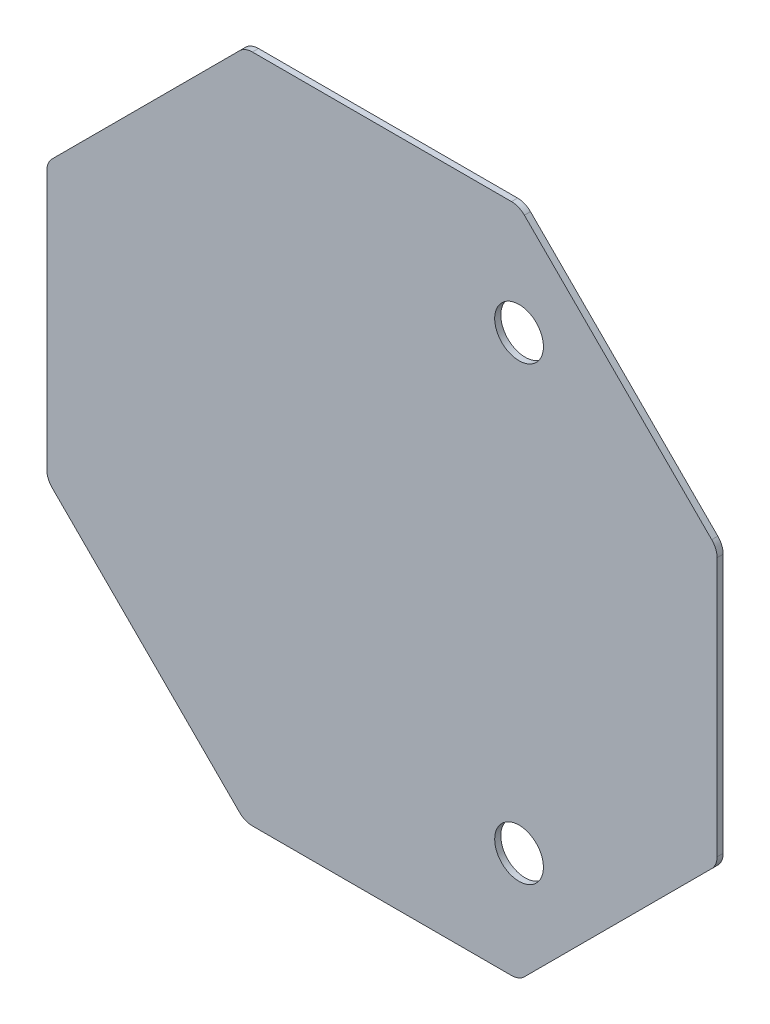
ISO-10303-21;
HEADER;
FILE_DESCRIPTION(('STEP AP214'),'2;1');
FILE_NAME('part.step','',(''),(''),'','','');
FILE_SCHEMA(('AUTOMOTIVE_DESIGN { 1 0 10303 214 1 1 1 1 }'));
ENDSEC;
DATA;
#1=APPLICATION_CONTEXT('core data for automotive mechanical design processes');
#2=APPLICATION_PROTOCOL_DEFINITION('international standard','automotive_design',2000,#1);
#3=PRODUCT_CONTEXT('',#1,'mechanical');
#4=PRODUCT('Part','Part','',(#3));
#5=PRODUCT_RELATED_PRODUCT_CATEGORY('part','',(#4));
#6=PRODUCT_DEFINITION_FORMATION('','',#4);
#7=PRODUCT_DEFINITION_CONTEXT('part definition',#1,'design');
#8=PRODUCT_DEFINITION('design','',#6,#7);
#9=PRODUCT_DEFINITION_SHAPE('','',#8);
#10=(LENGTH_UNIT() NAMED_UNIT(*) SI_UNIT(.MILLI.,.METRE.));
#11=(NAMED_UNIT(*) PLANE_ANGLE_UNIT() SI_UNIT($,.RADIAN.));
#12=(NAMED_UNIT(*) SI_UNIT($,.STERADIAN.) SOLID_ANGLE_UNIT());
#13=UNCERTAINTY_MEASURE_WITH_UNIT(LENGTH_MEASURE(1.E-05),#10,'distance_accuracy_value','');
#14=(GEOMETRIC_REPRESENTATION_CONTEXT(3) GLOBAL_UNCERTAINTY_ASSIGNED_CONTEXT((#13)) GLOBAL_UNIT_ASSIGNED_CONTEXT((#10,
#11,#12)) REPRESENTATION_CONTEXT('',''));
#15=CARTESIAN_POINT('',(0.,0.,0.));
#16=DIRECTION('',(0.,0.,1.));
#17=DIRECTION('',(1.,0.,0.));
#18=AXIS2_PLACEMENT_3D('',#15,#16,#17);
#19=CARTESIAN_POINT('',(-52.,21.2573593128807,1.));
#20=DIRECTION('',(0.,0.,1.));
#21=DIRECTION('',(1.,0.,0.));
#22=AXIS2_PLACEMENT_3D('',#19,#20,#21);
#23=PLANE('',#22);
#24=CARTESIAN_POINT('',(22.5,37.,1.));
#25=DIRECTION('',(0.,0.,1.));
#26=DIRECTION('',(1.,0.,0.));
#27=AXIS2_PLACEMENT_3D('',#24,#25,#26);
#28=CIRCLE('',#27,4.);
#29=CARTESIAN_POINT('',(26.5,37.,1.));
#30=VERTEX_POINT('',#29);
#31=EDGE_CURVE('E181',#30,#30,#28,.T.);
#32=ORIENTED_EDGE('',*,*,#31,.F.);
#33=EDGE_LOOP('',(#32));
#34=FACE_BOUND('',#33,.T.);
#35=CARTESIAN_POINT('',(-52.,21.2573593128807,1.));
#36=DIRECTION('',(0.,0.,1.));
#37=DIRECTION('',(1.,0.,0.));
#38=AXIS2_PLACEMENT_3D('',#35,#36,#37);
#39=CIRCLE('',#38,3.);
#40=CARTESIAN_POINT('',(-54.1213203435596,23.3786796564404,1.));
#41=VERTEX_POINT('',#40);
#42=CARTESIAN_POINT('',(-55.,21.2573593128807,1.));
#43=VERTEX_POINT('',#42);
#44=EDGE_CURVE('E208',#41,#43,#39,.T.);
#45=ORIENTED_EDGE('',*,*,#44,.T.);
#46=DIRECTION('',(0.,-1.,0.));
#47=VECTOR('',#46,1.);
#48=CARTESIAN_POINT('',(-55.,-21.2573593128807,1.));
#49=LINE('',#48,#47);
#50=CARTESIAN_POINT('',(-55.,-21.2573593128807,1.));
#51=VERTEX_POINT('',#50);
#52=EDGE_CURVE('E116',#43,#51,#49,.T.);
#53=ORIENTED_EDGE('',*,*,#52,.T.);
#54=CARTESIAN_POINT('',(-52.,-21.2573593128807,1.));
#55=DIRECTION('',(0.,0.,1.));
#56=DIRECTION('',(1.,0.,0.));
#57=AXIS2_PLACEMENT_3D('',#54,#55,#56);
#58=CIRCLE('',#57,3.);
#59=CARTESIAN_POINT('',(-54.1213203435596,-23.3786796564404,1.));
#60=VERTEX_POINT('',#59);
#61=EDGE_CURVE('E247',#51,#60,#58,.T.);
#62=ORIENTED_EDGE('',*,*,#61,.T.);
#63=DIRECTION('',(0.707106781186548,-0.707106781186547,0.));
#64=VECTOR('',#63,1.);
#65=CARTESIAN_POINT('',(-54.1213203435596,-23.3786796564404,1.));
#66=LINE('',#65,#64);
#67=CARTESIAN_POINT('',(-23.3786796564404,-54.1213203435596,1.));
#68=VERTEX_POINT('',#67);
#69=EDGE_CURVE('E266',#60,#68,#66,.T.);
#70=ORIENTED_EDGE('',*,*,#69,.T.);
#71=CARTESIAN_POINT('',(-21.2573593128807,-52.,1.));
#72=DIRECTION('',(0.,0.,1.));
#73=DIRECTION('',(1.,0.,0.));
#74=AXIS2_PLACEMENT_3D('',#71,#72,#73);
#75=CIRCLE('',#74,3.);
#76=CARTESIAN_POINT('',(-21.2573593128807,-55.,1.));
#77=VERTEX_POINT('',#76);
#78=EDGE_CURVE('E263',#68,#77,#75,.T.);
#79=ORIENTED_EDGE('',*,*,#78,.T.);
#80=DIRECTION('',(1.,0.,0.));
#81=VECTOR('',#80,1.);
#82=CARTESIAN_POINT('',(-21.2573593128807,-55.,1.));
#83=LINE('',#82,#81);
#84=CARTESIAN_POINT('',(21.2573593128807,-55.,1.));
#85=VERTEX_POINT('',#84);
#86=EDGE_CURVE('E265',#77,#85,#83,.T.);
#87=ORIENTED_EDGE('',*,*,#86,.T.);
#88=CARTESIAN_POINT('',(21.2573593128807,-52.,1.));
#89=DIRECTION('',(0.,0.,1.));
#90=DIRECTION('',(1.,0.,0.));
#91=AXIS2_PLACEMENT_3D('',#88,#89,#90);
#92=CIRCLE('',#91,3.);
#93=CARTESIAN_POINT('',(23.3786796564404,-54.1213203435596,1.));
#94=VERTEX_POINT('',#93);
#95=EDGE_CURVE('E268',#85,#94,#92,.T.);
#96=ORIENTED_EDGE('',*,*,#95,.T.);
#97=DIRECTION('',(0.707106781186547,0.707106781186548,0.));
#98=VECTOR('',#97,1.);
#99=CARTESIAN_POINT('',(23.3786796564404,-54.1213203435596,1.));
#100=LINE('',#99,#98);
#101=CARTESIAN_POINT('',(54.1213203435596,-23.3786796564404,1.));
#102=VERTEX_POINT('',#101);
#103=EDGE_CURVE('E274',#94,#102,#100,.T.);
#104=ORIENTED_EDGE('',*,*,#103,.T.);
#105=CARTESIAN_POINT('',(52.,-21.2573593128807,1.));
#106=DIRECTION('',(0.,0.,1.));
#107=DIRECTION('',(1.,0.,0.));
#108=AXIS2_PLACEMENT_3D('',#105,#106,#107);
#109=CIRCLE('',#108,3.);
#110=CARTESIAN_POINT('',(55.,-21.2573593128807,1.));
#111=VERTEX_POINT('',#110);
#112=EDGE_CURVE('E276',#102,#111,#109,.T.);
#113=ORIENTED_EDGE('',*,*,#112,.T.);
#114=DIRECTION('',(0.,1.,0.));
#115=VECTOR('',#114,1.);
#116=CARTESIAN_POINT('',(55.,-21.2573593128807,1.));
#117=LINE('',#116,#115);
#118=CARTESIAN_POINT('',(55.,21.2573593128807,1.));
#119=VERTEX_POINT('',#118);
#120=EDGE_CURVE('E278',#111,#119,#117,.T.);
#121=ORIENTED_EDGE('',*,*,#120,.T.);
#122=CARTESIAN_POINT('',(52.,21.2573593128807,1.));
#123=DIRECTION('',(0.,0.,1.));
#124=DIRECTION('',(1.,0.,0.));
#125=AXIS2_PLACEMENT_3D('',#122,#123,#124);
#126=CIRCLE('',#125,3.);
#127=CARTESIAN_POINT('',(54.1213203435596,23.3786796564404,1.));
#128=VERTEX_POINT('',#127);
#129=EDGE_CURVE('E280',#119,#128,#126,.T.);
#130=ORIENTED_EDGE('',*,*,#129,.T.);
#131=DIRECTION('',(-0.707106781186547,0.707106781186548,0.));
#132=VECTOR('',#131,1.);
#133=CARTESIAN_POINT('',(23.3786796564404,54.1213203435596,1.));
#134=LINE('',#133,#132);
#135=CARTESIAN_POINT('',(23.3786796564404,54.1213203435596,1.));
#136=VERTEX_POINT('',#135);
#137=EDGE_CURVE('E282',#128,#136,#134,.T.);
#138=ORIENTED_EDGE('',*,*,#137,.T.);
#139=CARTESIAN_POINT('',(21.2573593128807,52.,1.));
#140=DIRECTION('',(0.,0.,1.));
#141=DIRECTION('',(1.,0.,0.));
#142=AXIS2_PLACEMENT_3D('',#139,#140,#141);
#143=CIRCLE('',#142,3.);
#144=CARTESIAN_POINT('',(21.2573593128807,55.,1.));
#145=VERTEX_POINT('',#144);
#146=EDGE_CURVE('E159',#136,#145,#143,.T.);
#147=ORIENTED_EDGE('',*,*,#146,.T.);
#148=DIRECTION('',(-1.,0.,0.));
#149=VECTOR('',#148,1.);
#150=CARTESIAN_POINT('',(-21.2573593128807,55.,1.));
#151=LINE('',#150,#149);
#152=CARTESIAN_POINT('',(-21.2573593128807,55.,1.));
#153=VERTEX_POINT('',#152);
#154=EDGE_CURVE('E153',#145,#153,#151,.T.);
#155=ORIENTED_EDGE('',*,*,#154,.T.);
#156=CARTESIAN_POINT('',(-21.2573593128807,52.,1.));
#157=DIRECTION('',(0.,0.,1.));
#158=DIRECTION('',(-1.,0.,0.));
#159=AXIS2_PLACEMENT_3D('',#156,#157,#158);
#160=CIRCLE('',#159,3.);
#161=CARTESIAN_POINT('',(-23.3786796564404,54.1213203435596,1.));
#162=VERTEX_POINT('',#161);
#163=EDGE_CURVE('E157',#153,#162,#160,.T.);
#164=ORIENTED_EDGE('',*,*,#163,.T.);
#165=DIRECTION('',(-0.707106781186548,-0.707106781186547,0.));
#166=VECTOR('',#165,1.);
#167=CARTESIAN_POINT('',(-23.3786796564404,54.1213203435596,1.));
#168=LINE('',#167,#166);
#169=EDGE_CURVE('E49',#162,#41,#168,.T.);
#170=ORIENTED_EDGE('',*,*,#169,.T.);
#171=EDGE_LOOP('',(#45,#53,#62,#70,#79,#87,#96,#104,#113,#121,#130,#138,#147,#155,#164,#170));
#172=FACE_BOUND('',#171,.T.);
#173=CARTESIAN_POINT('',(22.5,-37.,1.));
#174=DIRECTION('',(0.,0.,1.));
#175=DIRECTION('',(-1.,0.,0.));
#176=AXIS2_PLACEMENT_3D('',#173,#174,#175);
#177=CIRCLE('',#176,4.);
#178=CARTESIAN_POINT('',(18.5,-37.,1.));
#179=VERTEX_POINT('',#178);
#180=EDGE_CURVE('E324',#179,#179,#177,.T.);
#181=ORIENTED_EDGE('',*,*,#180,.F.);
#182=EDGE_LOOP('',(#181));
#183=FACE_BOUND('',#182,.T.);
#184=ADVANCED_FACE('F32',(#34,#172,#183),#23,.T.);
#185=CARTESIAN_POINT('',(-52.,21.2573593128807,0.));
#186=DIRECTION('',(0.,0.,1.));
#187=DIRECTION('',(1.,0.,0.));
#188=AXIS2_PLACEMENT_3D('',#185,#186,#187);
#189=PLANE('',#188);
#190=CARTESIAN_POINT('',(-52.,21.2573593128807,0.));
#191=DIRECTION('',(0.,0.,1.));
#192=DIRECTION('',(1.,0.,0.));
#193=AXIS2_PLACEMENT_3D('',#190,#191,#192);
#194=CIRCLE('',#193,3.);
#195=CARTESIAN_POINT('',(-54.1213203435596,23.3786796564404,0.));
#196=VERTEX_POINT('',#195);
#197=CARTESIAN_POINT('',(-55.,21.2573593128807,0.));
#198=VERTEX_POINT('',#197);
#199=EDGE_CURVE('E177',#196,#198,#194,.T.);
#200=ORIENTED_EDGE('',*,*,#199,.F.);
#201=DIRECTION('',(-0.707106781186548,-0.707106781186547,0.));
#202=VECTOR('',#201,1.);
#203=CARTESIAN_POINT('',(-23.3786796564404,54.1213203435596,0.));
#204=LINE('',#203,#202);
#205=CARTESIAN_POINT('',(-23.3786796564404,54.1213203435596,0.));
#206=VERTEX_POINT('',#205);
#207=EDGE_CURVE('E108',#206,#196,#204,.T.);
#208=ORIENTED_EDGE('',*,*,#207,.F.);
#209=CARTESIAN_POINT('',(-21.2573593128807,52.,0.));
#210=DIRECTION('',(0.,0.,1.));
#211=DIRECTION('',(-1.,0.,0.));
#212=AXIS2_PLACEMENT_3D('',#209,#210,#211);
#213=CIRCLE('',#212,3.);
#214=CARTESIAN_POINT('',(-21.2573593128807,55.,0.));
#215=VERTEX_POINT('',#214);
#216=EDGE_CURVE('E102',#215,#206,#213,.T.);
#217=ORIENTED_EDGE('',*,*,#216,.F.);
#218=DIRECTION('',(-1.,0.,0.));
#219=VECTOR('',#218,1.);
#220=CARTESIAN_POINT('',(-21.2573593128807,55.,0.));
#221=LINE('',#220,#219);
#222=CARTESIAN_POINT('',(21.2573593128807,55.,0.));
#223=VERTEX_POINT('',#222);
#224=EDGE_CURVE('E167',#223,#215,#221,.T.);
#225=ORIENTED_EDGE('',*,*,#224,.F.);
#226=CARTESIAN_POINT('',(21.2573593128807,52.,0.));
#227=DIRECTION('',(0.,0.,1.));
#228=DIRECTION('',(1.,0.,0.));
#229=AXIS2_PLACEMENT_3D('',#226,#227,#228);
#230=CIRCLE('',#229,3.);
#231=CARTESIAN_POINT('',(23.3786796564404,54.1213203435596,0.));
#232=VERTEX_POINT('',#231);
#233=EDGE_CURVE('E203',#232,#223,#230,.T.);
#234=ORIENTED_EDGE('',*,*,#233,.F.);
#235=DIRECTION('',(-0.707106781186547,0.707106781186548,0.));
#236=VECTOR('',#235,1.);
#237=CARTESIAN_POINT('',(23.3786796564404,54.1213203435596,0.));
#238=LINE('',#237,#236);
#239=CARTESIAN_POINT('',(54.1213203435596,23.3786796564404,0.));
#240=VERTEX_POINT('',#239);
#241=EDGE_CURVE('E201',#240,#232,#238,.T.);
#242=ORIENTED_EDGE('',*,*,#241,.F.);
#243=CARTESIAN_POINT('',(52.,21.2573593128807,0.));
#244=DIRECTION('',(0.,0.,1.));
#245=DIRECTION('',(1.,0.,0.));
#246=AXIS2_PLACEMENT_3D('',#243,#244,#245);
#247=CIRCLE('',#246,3.);
#248=CARTESIAN_POINT('',(55.,21.2573593128807,0.));
#249=VERTEX_POINT('',#248);
#250=EDGE_CURVE('E199',#249,#240,#247,.T.);
#251=ORIENTED_EDGE('',*,*,#250,.F.);
#252=DIRECTION('',(0.,1.,0.));
#253=VECTOR('',#252,1.);
#254=CARTESIAN_POINT('',(55.,-21.2573593128807,0.));
#255=LINE('',#254,#253);
#256=CARTESIAN_POINT('',(55.,-21.2573593128807,0.));
#257=VERTEX_POINT('',#256);
#258=EDGE_CURVE('E197',#257,#249,#255,.T.);
#259=ORIENTED_EDGE('',*,*,#258,.F.);
#260=CARTESIAN_POINT('',(52.,-21.2573593128807,0.));
#261=DIRECTION('',(0.,0.,1.));
#262=DIRECTION('',(1.,0.,0.));
#263=AXIS2_PLACEMENT_3D('',#260,#261,#262);
#264=CIRCLE('',#263,3.);
#265=CARTESIAN_POINT('',(54.1213203435596,-23.3786796564404,0.));
#266=VERTEX_POINT('',#265);
#267=EDGE_CURVE('E195',#266,#257,#264,.T.);
#268=ORIENTED_EDGE('',*,*,#267,.F.);
#269=DIRECTION('',(0.707106781186547,0.707106781186548,0.));
#270=VECTOR('',#269,1.);
#271=CARTESIAN_POINT('',(23.3786796564404,-54.1213203435596,0.));
#272=LINE('',#271,#270);
#273=CARTESIAN_POINT('',(23.3786796564404,-54.1213203435596,0.));
#274=VERTEX_POINT('',#273);
#275=EDGE_CURVE('E193',#274,#266,#272,.T.);
#276=ORIENTED_EDGE('',*,*,#275,.F.);
#277=CARTESIAN_POINT('',(21.2573593128807,-52.,0.));
#278=DIRECTION('',(0.,0.,1.));
#279=DIRECTION('',(1.,0.,0.));
#280=AXIS2_PLACEMENT_3D('',#277,#278,#279);
#281=CIRCLE('',#280,3.);
#282=CARTESIAN_POINT('',(21.2573593128807,-55.,0.));
#283=VERTEX_POINT('',#282);
#284=EDGE_CURVE('E191',#283,#274,#281,.T.);
#285=ORIENTED_EDGE('',*,*,#284,.F.);
#286=DIRECTION('',(1.,0.,0.));
#287=VECTOR('',#286,1.);
#288=CARTESIAN_POINT('',(-21.2573593128807,-55.,0.));
#289=LINE('',#288,#287);
#290=CARTESIAN_POINT('',(-21.2573593128807,-55.,0.));
#291=VERTEX_POINT('',#290);
#292=EDGE_CURVE('E189',#291,#283,#289,.T.);
#293=ORIENTED_EDGE('',*,*,#292,.F.);
#294=CARTESIAN_POINT('',(-21.2573593128807,-52.,0.));
#295=DIRECTION('',(0.,0.,1.));
#296=DIRECTION('',(1.,0.,0.));
#297=AXIS2_PLACEMENT_3D('',#294,#295,#296);
#298=CIRCLE('',#297,3.);
#299=CARTESIAN_POINT('',(-23.3786796564404,-54.1213203435596,0.));
#300=VERTEX_POINT('',#299);
#301=EDGE_CURVE('E187',#300,#291,#298,.T.);
#302=ORIENTED_EDGE('',*,*,#301,.F.);
#303=DIRECTION('',(0.707106781186548,-0.707106781186547,0.));
#304=VECTOR('',#303,1.);
#305=CARTESIAN_POINT('',(-54.1213203435596,-23.3786796564404,0.));
#306=LINE('',#305,#304);
#307=CARTESIAN_POINT('',(-54.1213203435596,-23.3786796564404,0.));
#308=VERTEX_POINT('',#307);
#309=EDGE_CURVE('E185',#308,#300,#306,.T.);
#310=ORIENTED_EDGE('',*,*,#309,.F.);
#311=CARTESIAN_POINT('',(-52.,-21.2573593128807,0.));
#312=DIRECTION('',(0.,0.,1.));
#313=DIRECTION('',(1.,0.,0.));
#314=AXIS2_PLACEMENT_3D('',#311,#312,#313);
#315=CIRCLE('',#314,3.);
#316=CARTESIAN_POINT('',(-55.,-21.2573593128807,0.));
#317=VERTEX_POINT('',#316);
#318=EDGE_CURVE('E183',#317,#308,#315,.T.);
#319=ORIENTED_EDGE('',*,*,#318,.F.);
#320=DIRECTION('',(0.,-1.,0.));
#321=VECTOR('',#320,1.);
#322=CARTESIAN_POINT('',(-55.,-21.2573593128807,0.));
#323=LINE('',#322,#321);
#324=EDGE_CURVE('E180',#198,#317,#323,.T.);
#325=ORIENTED_EDGE('',*,*,#324,.F.);
#326=EDGE_LOOP('',(#200,#208,#217,#225,#234,#242,#251,#259,#268,#276,#285,#293,#302,#310,#319,#325));
#327=FACE_BOUND('',#326,.T.);
#328=CARTESIAN_POINT('',(22.5,37.,0.));
#329=DIRECTION('',(0.,0.,1.));
#330=DIRECTION('',(1.,0.,0.));
#331=AXIS2_PLACEMENT_3D('',#328,#329,#330);
#332=CIRCLE('',#331,4.);
#333=CARTESIAN_POINT('',(26.5,37.,0.));
#334=VERTEX_POINT('',#333);
#335=EDGE_CURVE('E330',#334,#334,#332,.T.);
#336=ORIENTED_EDGE('',*,*,#335,.T.);
#337=EDGE_LOOP('',(#336));
#338=FACE_BOUND('',#337,.T.);
#339=CARTESIAN_POINT('',(22.5,-37.,0.));
#340=DIRECTION('',(0.,0.,1.));
#341=DIRECTION('',(-1.,0.,0.));
#342=AXIS2_PLACEMENT_3D('',#339,#340,#341);
#343=CIRCLE('',#342,4.);
#344=CARTESIAN_POINT('',(18.5,-37.,0.));
#345=VERTEX_POINT('',#344);
#346=EDGE_CURVE('E327',#345,#345,#343,.T.);
#347=ORIENTED_EDGE('',*,*,#346,.T.);
#348=EDGE_LOOP('',(#347));
#349=FACE_BOUND('',#348,.T.);
#350=ADVANCED_FACE('F251',(#327,#338,#349),#189,.F.);
#351=CARTESIAN_POINT('',(-52.,21.2573593128807,1.));
#352=DIRECTION('',(0.,0.,-1.));
#353=DIRECTION('',(-1.,0.,0.));
#354=AXIS2_PLACEMENT_3D('',#351,#352,#353);
#355=CYLINDRICAL_SURFACE('',#354,3.);
#356=ORIENTED_EDGE('',*,*,#199,.T.);
#357=DIRECTION('',(0.,0.,-1.));
#358=VECTOR('',#357,1.);
#359=CARTESIAN_POINT('',(-55.,21.2573593128807,1.));
#360=LINE('',#359,#358);
#361=EDGE_CURVE('E11',#43,#198,#360,.T.);
#362=ORIENTED_EDGE('',*,*,#361,.F.);
#363=ORIENTED_EDGE('',*,*,#44,.F.);
#364=DIRECTION('',(0.,0.,-1.));
#365=VECTOR('',#364,1.);
#366=CARTESIAN_POINT('',(-54.1213203435596,23.3786796564404,1.));
#367=LINE('',#366,#365);
#368=EDGE_CURVE('E173',#41,#196,#367,.T.);
#369=ORIENTED_EDGE('',*,*,#368,.T.);
#370=EDGE_LOOP('',(#356,#362,#363,#369));
#371=FACE_BOUND('',#370,.T.);
#372=ADVANCED_FACE('F34',(#371),#355,.T.);
#373=CARTESIAN_POINT('',(-55.,-21.2573593128807,1.));
#374=DIRECTION('',(1.,0.,0.));
#375=DIRECTION('',(0.,0.,-1.));
#376=AXIS2_PLACEMENT_3D('',#373,#374,#375);
#377=PLANE('',#376);
#378=ORIENTED_EDGE('',*,*,#324,.T.);
#379=DIRECTION('',(0.,0.,-1.));
#380=VECTOR('',#379,1.);
#381=CARTESIAN_POINT('',(-55.,-21.2573593128807,1.));
#382=LINE('',#381,#380);
#383=EDGE_CURVE('E41',#51,#317,#382,.T.);
#384=ORIENTED_EDGE('',*,*,#383,.F.);
#385=ORIENTED_EDGE('',*,*,#52,.F.);
#386=ORIENTED_EDGE('',*,*,#361,.T.);
#387=EDGE_LOOP('',(#378,#384,#385,#386));
#388=FACE_BOUND('',#387,.T.);
#389=ADVANCED_FACE('F463',(#388),#377,.F.);
#390=CARTESIAN_POINT('',(-52.,-21.2573593128807,1.));
#391=DIRECTION('',(0.,0.,-1.));
#392=DIRECTION('',(-1.,0.,0.));
#393=AXIS2_PLACEMENT_3D('',#390,#391,#392);
#394=CYLINDRICAL_SURFACE('',#393,3.);
#395=ORIENTED_EDGE('',*,*,#318,.T.);
#396=DIRECTION('',(0.,0.,-1.));
#397=VECTOR('',#396,1.);
#398=CARTESIAN_POINT('',(-54.1213203435596,-23.3786796564404,1.));
#399=LINE('',#398,#397);
#400=EDGE_CURVE('E239',#60,#308,#399,.T.);
#401=ORIENTED_EDGE('',*,*,#400,.F.);
#402=ORIENTED_EDGE('',*,*,#61,.F.);
#403=ORIENTED_EDGE('',*,*,#383,.T.);
#404=EDGE_LOOP('',(#395,#401,#402,#403));
#405=FACE_BOUND('',#404,.T.);
#406=ADVANCED_FACE('F245',(#405),#394,.T.);
#407=CARTESIAN_POINT('',(-54.1213203435596,-23.3786796564404,1.));
#408=DIRECTION('',(0.707106781186547,0.707106781186548,0.));
#409=DIRECTION('',(-0.707106781186548,0.707106781186547,0.));
#410=AXIS2_PLACEMENT_3D('',#407,#408,#409);
#411=PLANE('',#410);
#412=ORIENTED_EDGE('',*,*,#309,.T.);
#413=DIRECTION('',(0.,0.,-1.));
#414=VECTOR('',#413,1.);
#415=CARTESIAN_POINT('',(-23.3786796564404,-54.1213203435596,1.));
#416=LINE('',#415,#414);
#417=EDGE_CURVE('E236',#68,#300,#416,.T.);
#418=ORIENTED_EDGE('',*,*,#417,.F.);
#419=ORIENTED_EDGE('',*,*,#69,.F.);
#420=ORIENTED_EDGE('',*,*,#400,.T.);
#421=EDGE_LOOP('',(#412,#418,#419,#420));
#422=FACE_BOUND('',#421,.T.);
#423=ADVANCED_FACE('F257',(#422),#411,.F.);
#424=CARTESIAN_POINT('',(-21.2573593128807,-52.,1.));
#425=DIRECTION('',(0.,0.,-1.));
#426=DIRECTION('',(-1.,0.,0.));
#427=AXIS2_PLACEMENT_3D('',#424,#425,#426);
#428=CYLINDRICAL_SURFACE('',#427,3.);
#429=ORIENTED_EDGE('',*,*,#301,.T.);
#430=DIRECTION('',(0.,0.,-1.));
#431=VECTOR('',#430,1.);
#432=CARTESIAN_POINT('',(-21.2573593128807,-55.,1.));
#433=LINE('',#432,#431);
#434=EDGE_CURVE('E233',#77,#291,#433,.T.);
#435=ORIENTED_EDGE('',*,*,#434,.F.);
#436=ORIENTED_EDGE('',*,*,#78,.F.);
#437=ORIENTED_EDGE('',*,*,#417,.T.);
#438=EDGE_LOOP('',(#429,#435,#436,#437));
#439=FACE_BOUND('',#438,.T.);
#440=ADVANCED_FACE('F261',(#439),#428,.T.);
#441=CARTESIAN_POINT('',(-21.2573593128807,-55.,1.));
#442=DIRECTION('',(0.,1.,0.));
#443=DIRECTION('',(-1.,0.,0.));
#444=AXIS2_PLACEMENT_3D('',#441,#442,#443);
#445=PLANE('',#444);
#446=ORIENTED_EDGE('',*,*,#292,.T.);
#447=DIRECTION('',(0.,0.,-1.));
#448=VECTOR('',#447,1.);
#449=CARTESIAN_POINT('',(21.2573593128807,-55.,1.));
#450=LINE('',#449,#448);
#451=EDGE_CURVE('E230',#85,#283,#450,.T.);
#452=ORIENTED_EDGE('',*,*,#451,.F.);
#453=ORIENTED_EDGE('',*,*,#86,.F.);
#454=ORIENTED_EDGE('',*,*,#434,.T.);
#455=EDGE_LOOP('',(#446,#452,#453,#454));
#456=FACE_BOUND('',#455,.T.);
#457=ADVANCED_FACE('F428',(#456),#445,.F.);
#458=CARTESIAN_POINT('',(21.2573593128807,-52.,1.));
#459=DIRECTION('',(0.,0.,-1.));
#460=DIRECTION('',(-1.,0.,0.));
#461=AXIS2_PLACEMENT_3D('',#458,#459,#460);
#462=CYLINDRICAL_SURFACE('',#461,3.);
#463=ORIENTED_EDGE('',*,*,#284,.T.);
#464=DIRECTION('',(0.,0.,-1.));
#465=VECTOR('',#464,1.);
#466=CARTESIAN_POINT('',(23.3786796564404,-54.1213203435596,1.));
#467=LINE('',#466,#465);
#468=EDGE_CURVE('E227',#94,#274,#467,.T.);
#469=ORIENTED_EDGE('',*,*,#468,.F.);
#470=ORIENTED_EDGE('',*,*,#95,.F.);
#471=ORIENTED_EDGE('',*,*,#451,.T.);
#472=EDGE_LOOP('',(#463,#469,#470,#471));
#473=FACE_BOUND('',#472,.T.);
#474=ADVANCED_FACE('F418',(#473),#462,.T.);
#475=CARTESIAN_POINT('',(23.3786796564404,-54.1213203435596,1.));
#476=DIRECTION('',(-0.707106781186548,0.707106781186547,0.));
#477=DIRECTION('',(-0.707106781186547,-0.707106781186548,0.));
#478=AXIS2_PLACEMENT_3D('',#475,#476,#477);
#479=PLANE('',#478);
#480=ORIENTED_EDGE('',*,*,#275,.T.);
#481=DIRECTION('',(0.,0.,-1.));
#482=VECTOR('',#481,1.);
#483=CARTESIAN_POINT('',(54.1213203435596,-23.3786796564404,1.));
#484=LINE('',#483,#482);
#485=EDGE_CURVE('E224',#102,#266,#484,.T.);
#486=ORIENTED_EDGE('',*,*,#485,.F.);
#487=ORIENTED_EDGE('',*,*,#103,.F.);
#488=ORIENTED_EDGE('',*,*,#468,.T.);
#489=EDGE_LOOP('',(#480,#486,#487,#488));
#490=FACE_BOUND('',#489,.T.);
#491=ADVANCED_FACE('F408',(#490),#479,.F.);
#492=CARTESIAN_POINT('',(52.,-21.2573593128807,1.));
#493=DIRECTION('',(0.,0.,-1.));
#494=DIRECTION('',(-1.,0.,0.));
#495=AXIS2_PLACEMENT_3D('',#492,#493,#494);
#496=CYLINDRICAL_SURFACE('',#495,3.);
#497=ORIENTED_EDGE('',*,*,#267,.T.);
#498=DIRECTION('',(0.,0.,-1.));
#499=VECTOR('',#498,1.);
#500=CARTESIAN_POINT('',(55.,-21.2573593128807,1.));
#501=LINE('',#500,#499);
#502=EDGE_CURVE('E221',#111,#257,#501,.T.);
#503=ORIENTED_EDGE('',*,*,#502,.F.);
#504=ORIENTED_EDGE('',*,*,#112,.F.);
#505=ORIENTED_EDGE('',*,*,#485,.T.);
#506=EDGE_LOOP('',(#497,#503,#504,#505));
#507=FACE_BOUND('',#506,.T.);
#508=ADVANCED_FACE('F398',(#507),#496,.T.);
#509=CARTESIAN_POINT('',(55.,-21.2573593128807,1.));
#510=DIRECTION('',(-1.,0.,0.));
#511=DIRECTION('',(0.,0.,1.));
#512=AXIS2_PLACEMENT_3D('',#509,#510,#511);
#513=PLANE('',#512);
#514=ORIENTED_EDGE('',*,*,#258,.T.);
#515=DIRECTION('',(0.,0.,-1.));
#516=VECTOR('',#515,1.);
#517=CARTESIAN_POINT('',(55.,21.2573593128807,1.));
#518=LINE('',#517,#516);
#519=EDGE_CURVE('E218',#119,#249,#518,.T.);
#520=ORIENTED_EDGE('',*,*,#519,.F.);
#521=ORIENTED_EDGE('',*,*,#120,.F.);
#522=ORIENTED_EDGE('',*,*,#502,.T.);
#523=EDGE_LOOP('',(#514,#520,#521,#522));
#524=FACE_BOUND('',#523,.T.);
#525=ADVANCED_FACE('F388',(#524),#513,.F.);
#526=CARTESIAN_POINT('',(52.,21.2573593128807,1.));
#527=DIRECTION('',(0.,0.,-1.));
#528=DIRECTION('',(-1.,0.,0.));
#529=AXIS2_PLACEMENT_3D('',#526,#527,#528);
#530=CYLINDRICAL_SURFACE('',#529,3.);
#531=ORIENTED_EDGE('',*,*,#250,.T.);
#532=DIRECTION('',(0.,0.,-1.));
#533=VECTOR('',#532,1.);
#534=CARTESIAN_POINT('',(54.1213203435596,23.3786796564404,1.));
#535=LINE('',#534,#533);
#536=EDGE_CURVE('E215',#128,#240,#535,.T.);
#537=ORIENTED_EDGE('',*,*,#536,.F.);
#538=ORIENTED_EDGE('',*,*,#129,.F.);
#539=ORIENTED_EDGE('',*,*,#519,.T.);
#540=EDGE_LOOP('',(#531,#537,#538,#539));
#541=FACE_BOUND('',#540,.T.);
#542=ADVANCED_FACE('F379',(#541),#530,.T.);
#543=CARTESIAN_POINT('',(23.3786796564404,54.1213203435596,1.));
#544=DIRECTION('',(-0.707106781186548,-0.707106781186547,0.));
#545=DIRECTION('',(0.707106781186547,-0.707106781186548,0.));
#546=AXIS2_PLACEMENT_3D('',#543,#544,#545);
#547=PLANE('',#546);
#548=ORIENTED_EDGE('',*,*,#241,.T.);
#549=DIRECTION('',(0.,0.,-1.));
#550=VECTOR('',#549,1.);
#551=CARTESIAN_POINT('',(23.3786796564404,54.1213203435596,1.));
#552=LINE('',#551,#550);
#553=EDGE_CURVE('E212',#136,#232,#552,.T.);
#554=ORIENTED_EDGE('',*,*,#553,.F.);
#555=ORIENTED_EDGE('',*,*,#137,.F.);
#556=ORIENTED_EDGE('',*,*,#536,.T.);
#557=EDGE_LOOP('',(#548,#554,#555,#556));
#558=FACE_BOUND('',#557,.T.);
#559=ADVANCED_FACE('F288',(#558),#547,.F.);
#560=CARTESIAN_POINT('',(21.2573593128807,52.,1.));
#561=DIRECTION('',(0.,0.,-1.));
#562=DIRECTION('',(-1.,0.,0.));
#563=AXIS2_PLACEMENT_3D('',#560,#561,#562);
#564=CYLINDRICAL_SURFACE('',#563,3.);
#565=ORIENTED_EDGE('',*,*,#233,.T.);
#566=DIRECTION('',(0.,0.,-1.));
#567=VECTOR('',#566,1.);
#568=CARTESIAN_POINT('',(21.2573593128807,55.,1.));
#569=LINE('',#568,#567);
#570=EDGE_CURVE('E168',#145,#223,#569,.T.);
#571=ORIENTED_EDGE('',*,*,#570,.F.);
#572=ORIENTED_EDGE('',*,*,#146,.F.);
#573=ORIENTED_EDGE('',*,*,#553,.T.);
#574=EDGE_LOOP('',(#565,#571,#572,#573));
#575=FACE_BOUND('',#574,.T.);
#576=ADVANCED_FACE('F292',(#575),#564,.T.);
#577=CARTESIAN_POINT('',(-21.2573593128807,55.,1.));
#578=DIRECTION('',(0.,-1.,0.));
#579=DIRECTION('',(1.,0.,0.));
#580=AXIS2_PLACEMENT_3D('',#577,#578,#579);
#581=PLANE('',#580);
#582=ORIENTED_EDGE('',*,*,#224,.T.);
#583=DIRECTION('',(0.,0.,-1.));
#584=VECTOR('',#583,1.);
#585=CARTESIAN_POINT('',(-21.2573593128807,55.,1.));
#586=LINE('',#585,#584);
#587=EDGE_CURVE('E164',#153,#215,#586,.T.);
#588=ORIENTED_EDGE('',*,*,#587,.F.);
#589=ORIENTED_EDGE('',*,*,#154,.F.);
#590=ORIENTED_EDGE('',*,*,#570,.T.);
#591=EDGE_LOOP('',(#582,#588,#589,#590));
#592=FACE_BOUND('',#591,.T.);
#593=ADVANCED_FACE('F165',(#592),#581,.F.);
#594=CARTESIAN_POINT('',(-21.2573593128807,52.,1.));
#595=DIRECTION('',(0.,0.,-1.));
#596=DIRECTION('',(-1.,0.,0.));
#597=AXIS2_PLACEMENT_3D('',#594,#595,#596);
#598=CYLINDRICAL_SURFACE('',#597,3.);
#599=ORIENTED_EDGE('',*,*,#216,.T.);
#600=DIRECTION('',(0.,0.,-1.));
#601=VECTOR('',#600,1.);
#602=CARTESIAN_POINT('',(-23.3786796564404,54.1213203435596,1.));
#603=LINE('',#602,#601);
#604=EDGE_CURVE('E169',#162,#206,#603,.T.);
#605=ORIENTED_EDGE('',*,*,#604,.F.);
#606=ORIENTED_EDGE('',*,*,#163,.F.);
#607=ORIENTED_EDGE('',*,*,#587,.T.);
#608=EDGE_LOOP('',(#599,#605,#606,#607));
#609=FACE_BOUND('',#608,.T.);
#610=ADVANCED_FACE('F171',(#609),#598,.T.);
#611=CARTESIAN_POINT('',(-23.3786796564404,54.1213203435596,1.));
#612=DIRECTION('',(0.707106781186547,-0.707106781186548,0.));
#613=DIRECTION('',(0.707106781186548,0.707106781186547,0.));
#614=AXIS2_PLACEMENT_3D('',#611,#612,#613);
#615=PLANE('',#614);
#616=ORIENTED_EDGE('',*,*,#207,.T.);
#617=ORIENTED_EDGE('',*,*,#368,.F.);
#618=ORIENTED_EDGE('',*,*,#169,.F.);
#619=ORIENTED_EDGE('',*,*,#604,.T.);
#620=EDGE_LOOP('',(#616,#617,#618,#619));
#621=FACE_BOUND('',#620,.T.);
#622=ADVANCED_FACE('F296',(#621),#615,.F.);
#623=CARTESIAN_POINT('',(22.5,37.,1.));
#624=DIRECTION('',(0.,0.,-1.));
#625=DIRECTION('',(-1.,0.,0.));
#626=AXIS2_PLACEMENT_3D('',#623,#624,#625);
#627=CYLINDRICAL_SURFACE('',#626,4.);
#628=ORIENTED_EDGE('',*,*,#31,.T.);
#629=EDGE_LOOP('',(#628));
#630=FACE_BOUND('',#629,.T.);
#631=ORIENTED_EDGE('',*,*,#335,.F.);
#632=EDGE_LOOP('',(#631));
#633=FACE_BOUND('',#632,.T.);
#634=ADVANCED_FACE('F298',(#630,#633),#627,.F.);
#635=CARTESIAN_POINT('',(22.5,-37.,1.));
#636=DIRECTION('',(0.,0.,-1.));
#637=DIRECTION('',(-1.,0.,0.));
#638=AXIS2_PLACEMENT_3D('',#635,#636,#637);
#639=CYLINDRICAL_SURFACE('',#638,4.);
#640=ORIENTED_EDGE('',*,*,#180,.T.);
#641=EDGE_LOOP('',(#640));
#642=FACE_BOUND('',#641,.T.);
#643=ORIENTED_EDGE('',*,*,#346,.F.);
#644=EDGE_LOOP('',(#643));
#645=FACE_BOUND('',#644,.T.);
#646=ADVANCED_FACE('F304',(#642,#645),#639,.F.);
#647=CLOSED_SHELL('',(#184,#350,#372,#389,#406,#423,#440,#457,#474,#491,#508,#525,#542,#559,
#576,#593,#610,#622,#634,#646));
#648=MANIFOLD_SOLID_BREP('B2',#647);
#649=ADVANCED_BREP_SHAPE_REPRESENTATION('',(#18,#648),#14);
#650=SHAPE_DEFINITION_REPRESENTATION(#9,#649);
ENDSEC;
END-ISO-10303-21;
